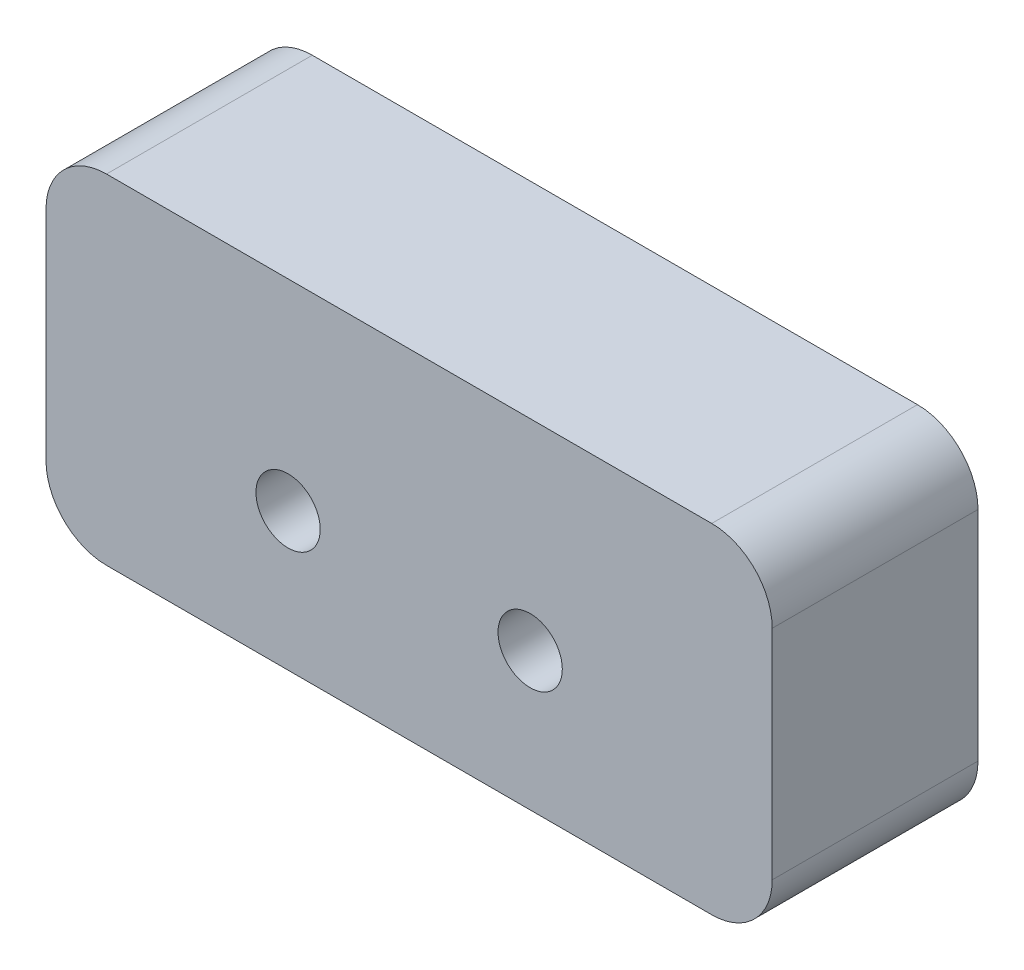
ISO-10303-21;
HEADER;
FILE_DESCRIPTION(('STEP AP214'),'2;1');
FILE_NAME('part.step','',(''),(''),'','','');
FILE_SCHEMA(('AUTOMOTIVE_DESIGN { 1 0 10303 214 1 1 1 1 }'));
ENDSEC;
DATA;
#1=APPLICATION_CONTEXT('core data for automotive mechanical design processes');
#2=APPLICATION_PROTOCOL_DEFINITION('international standard','automotive_design',2000,#1);
#3=PRODUCT_CONTEXT('',#1,'mechanical');
#4=PRODUCT('Part','Part','',(#3));
#5=PRODUCT_RELATED_PRODUCT_CATEGORY('part','',(#4));
#6=PRODUCT_DEFINITION_FORMATION('','',#4);
#7=PRODUCT_DEFINITION_CONTEXT('part definition',#1,'design');
#8=PRODUCT_DEFINITION('design','',#6,#7);
#9=PRODUCT_DEFINITION_SHAPE('','',#8);
#10=(LENGTH_UNIT() NAMED_UNIT(*) SI_UNIT(.MILLI.,.METRE.));
#11=(NAMED_UNIT(*) PLANE_ANGLE_UNIT() SI_UNIT($,.RADIAN.));
#12=(NAMED_UNIT(*) SI_UNIT($,.STERADIAN.) SOLID_ANGLE_UNIT());
#13=UNCERTAINTY_MEASURE_WITH_UNIT(LENGTH_MEASURE(1.E-05),#10,'distance_accuracy_value','');
#14=(GEOMETRIC_REPRESENTATION_CONTEXT(3) GLOBAL_UNCERTAINTY_ASSIGNED_CONTEXT((#13)) GLOBAL_UNIT_ASSIGNED_CONTEXT((#10,
#11,#12)) REPRESENTATION_CONTEXT('',''));
#15=CARTESIAN_POINT('',(0.,0.,0.));
#16=DIRECTION('',(0.,0.,1.));
#17=DIRECTION('',(1.,0.,0.));
#18=AXIS2_PLACEMENT_3D('',#15,#16,#17);
#19=CARTESIAN_POINT('',(0.,0.,21.59));
#20=DIRECTION('',(0.,0.,-1.));
#21=DIRECTION('',(-1.,0.,0.));
#22=AXIS2_PLACEMENT_3D('',#19,#20,#21);
#23=PLANE('',#22);
#24=DIRECTION('',(1.,0.,0.));
#25=VECTOR('',#24,1.);
#26=CARTESIAN_POINT('',(76.2,0.,21.59));
#27=LINE('',#26,#25);
#28=CARTESIAN_POINT('',(6.35000000000002,0.,21.59));
#29=VERTEX_POINT('',#28);
#30=CARTESIAN_POINT('',(69.85,0.,21.59));
#31=VERTEX_POINT('',#30);
#32=EDGE_CURVE('E136',#29,#31,#27,.T.);
#33=ORIENTED_EDGE('',*,*,#32,.T.);
#34=CARTESIAN_POINT('',(69.85,6.35,21.59));
#35=DIRECTION('',(0.,0.,-1.));
#36=DIRECTION('',(-1.,0.,0.));
#37=AXIS2_PLACEMENT_3D('',#34,#35,#36);
#38=CIRCLE('',#37,6.35);
#39=CARTESIAN_POINT('',(76.2,6.35,21.59));
#40=VERTEX_POINT('',#39);
#41=EDGE_CURVE('E181',#31,#40,#38,.F.);
#42=ORIENTED_EDGE('',*,*,#41,.T.);
#43=DIRECTION('',(0.,1.,0.));
#44=VECTOR('',#43,1.);
#45=CARTESIAN_POINT('',(76.2,35.56,21.59));
#46=LINE('',#45,#44);
#47=CARTESIAN_POINT('',(76.2,29.21,21.59));
#48=VERTEX_POINT('',#47);
#49=EDGE_CURVE('E139',#40,#48,#46,.T.);
#50=ORIENTED_EDGE('',*,*,#49,.T.);
#51=CARTESIAN_POINT('',(69.85,29.21,21.59));
#52=DIRECTION('',(0.,0.,-1.));
#53=DIRECTION('',(-1.,0.,0.));
#54=AXIS2_PLACEMENT_3D('',#51,#52,#53);
#55=CIRCLE('',#54,6.35);
#56=CARTESIAN_POINT('',(69.85,35.56,21.59));
#57=VERTEX_POINT('',#56);
#58=EDGE_CURVE('E177',#48,#57,#55,.F.);
#59=ORIENTED_EDGE('',*,*,#58,.T.);
#60=DIRECTION('',(-1.,0.,0.));
#61=VECTOR('',#60,1.);
#62=CARTESIAN_POINT('',(0.,35.56,21.59));
#63=LINE('',#62,#61);
#64=CARTESIAN_POINT('',(6.35,35.56,21.59));
#65=VERTEX_POINT('',#64);
#66=EDGE_CURVE('E143',#57,#65,#63,.T.);
#67=ORIENTED_EDGE('',*,*,#66,.T.);
#68=CARTESIAN_POINT('',(6.35,29.21,21.59));
#69=DIRECTION('',(0.,0.,-1.));
#70=DIRECTION('',(-1.,0.,0.));
#71=AXIS2_PLACEMENT_3D('',#68,#69,#70);
#72=CIRCLE('',#71,6.35);
#73=CARTESIAN_POINT('',(0.,29.21,21.59));
#74=VERTEX_POINT('',#73);
#75=EDGE_CURVE('E62',#65,#74,#72,.F.);
#76=ORIENTED_EDGE('',*,*,#75,.T.);
#77=DIRECTION('',(0.,-1.,0.));
#78=VECTOR('',#77,1.);
#79=CARTESIAN_POINT('',(0.,0.,21.59));
#80=LINE('',#79,#78);
#81=CARTESIAN_POINT('',(0.,6.35,21.59));
#82=VERTEX_POINT('',#81);
#83=EDGE_CURVE('E145',#74,#82,#80,.T.);
#84=ORIENTED_EDGE('',*,*,#83,.T.);
#85=CARTESIAN_POINT('',(6.34999999999999,6.35,21.59));
#86=DIRECTION('',(0.,0.,-1.));
#87=DIRECTION('',(-1.,0.,0.));
#88=AXIS2_PLACEMENT_3D('',#85,#86,#87);
#89=CIRCLE('',#88,6.35);
#90=EDGE_CURVE('E179',#82,#29,#89,.F.);
#91=ORIENTED_EDGE('',*,*,#90,.T.);
#92=EDGE_LOOP('',(#33,#42,#50,#59,#67,#76,#84,#91));
#93=FACE_BOUND('',#92,.T.);
#94=CARTESIAN_POINT('',(25.4,14.478,21.59));
#95=DIRECTION('',(0.,0.,1.));
#96=DIRECTION('',(1.,0.,0.));
#97=AXIS2_PLACEMENT_3D('',#94,#95,#96);
#98=CIRCLE('',#97,3.3734375);
#99=CARTESIAN_POINT('',(28.7734375,14.478,21.59));
#100=VERTEX_POINT('',#99);
#101=EDGE_CURVE('E129',#100,#100,#98,.T.);
#102=ORIENTED_EDGE('',*,*,#101,.F.);
#103=EDGE_LOOP('',(#102));
#104=FACE_BOUND('',#103,.T.);
#105=CARTESIAN_POINT('',(50.8,14.478,21.59));
#106=DIRECTION('',(0.,0.,1.));
#107=DIRECTION('',(1.,0.,0.));
#108=AXIS2_PLACEMENT_3D('',#105,#106,#107);
#109=CIRCLE('',#108,3.3734375);
#110=CARTESIAN_POINT('',(54.1734375,14.478,21.59));
#111=VERTEX_POINT('',#110);
#112=EDGE_CURVE('E121',#111,#111,#109,.T.);
#113=ORIENTED_EDGE('',*,*,#112,.F.);
#114=EDGE_LOOP('',(#113));
#115=FACE_BOUND('',#114,.T.);
#116=ADVANCED_FACE('F40',(#93,#104,#115),#23,.F.);
#117=CARTESIAN_POINT('',(0.,0.,0.));
#118=DIRECTION('',(0.,0.,-1.));
#119=DIRECTION('',(-1.,0.,0.));
#120=AXIS2_PLACEMENT_3D('',#117,#118,#119);
#121=PLANE('',#120);
#122=CARTESIAN_POINT('',(25.4,14.478,0.));
#123=DIRECTION('',(0.,0.,1.));
#124=DIRECTION('',(1.,0.,0.));
#125=AXIS2_PLACEMENT_3D('',#122,#123,#124);
#126=CIRCLE('',#125,3.3734375);
#127=CARTESIAN_POINT('',(28.7734375,14.478,0.));
#128=VERTEX_POINT('',#127);
#129=EDGE_CURVE('E127',#128,#128,#126,.T.);
#130=ORIENTED_EDGE('',*,*,#129,.T.);
#131=EDGE_LOOP('',(#130));
#132=FACE_BOUND('',#131,.T.);
#133=DIRECTION('',(0.,1.,0.));
#134=VECTOR('',#133,1.);
#135=CARTESIAN_POINT('',(76.2,35.56,0.));
#136=LINE('',#135,#134);
#137=CARTESIAN_POINT('',(76.2,6.35,0.));
#138=VERTEX_POINT('',#137);
#139=CARTESIAN_POINT('',(76.2,29.21,0.));
#140=VERTEX_POINT('',#139);
#141=EDGE_CURVE('E151',#138,#140,#136,.T.);
#142=ORIENTED_EDGE('',*,*,#141,.F.);
#143=CARTESIAN_POINT('',(69.85,6.35,0.));
#144=DIRECTION('',(0.,0.,-1.));
#145=DIRECTION('',(-1.,0.,0.));
#146=AXIS2_PLACEMENT_3D('',#143,#144,#145);
#147=CIRCLE('',#146,6.35);
#148=CARTESIAN_POINT('',(69.85,0.,0.));
#149=VERTEX_POINT('',#148);
#150=EDGE_CURVE('E169',#138,#149,#147,.T.);
#151=ORIENTED_EDGE('',*,*,#150,.T.);
#152=DIRECTION('',(1.,0.,0.));
#153=VECTOR('',#152,1.);
#154=CARTESIAN_POINT('',(76.2,0.,0.));
#155=LINE('',#154,#153);
#156=CARTESIAN_POINT('',(6.35000000000002,0.,0.));
#157=VERTEX_POINT('',#156);
#158=EDGE_CURVE('E132',#157,#149,#155,.T.);
#159=ORIENTED_EDGE('',*,*,#158,.F.);
#160=CARTESIAN_POINT('',(6.34999999999999,6.35,0.));
#161=DIRECTION('',(0.,0.,-1.));
#162=DIRECTION('',(-1.,0.,0.));
#163=AXIS2_PLACEMENT_3D('',#160,#161,#162);
#164=CIRCLE('',#163,6.35);
#165=CARTESIAN_POINT('',(0.,6.35,0.));
#166=VERTEX_POINT('',#165);
#167=EDGE_CURVE('E167',#157,#166,#164,.T.);
#168=ORIENTED_EDGE('',*,*,#167,.T.);
#169=DIRECTION('',(0.,-1.,0.));
#170=VECTOR('',#169,1.);
#171=CARTESIAN_POINT('',(0.,0.,0.));
#172=LINE('',#171,#170);
#173=CARTESIAN_POINT('',(0.,29.21,0.));
#174=VERTEX_POINT('',#173);
#175=EDGE_CURVE('E140',#174,#166,#172,.T.);
#176=ORIENTED_EDGE('',*,*,#175,.F.);
#177=CARTESIAN_POINT('',(6.35,29.21,0.));
#178=DIRECTION('',(0.,0.,-1.));
#179=DIRECTION('',(-1.,0.,0.));
#180=AXIS2_PLACEMENT_3D('',#177,#178,#179);
#181=CIRCLE('',#180,6.35);
#182=CARTESIAN_POINT('',(6.35,35.56,0.));
#183=VERTEX_POINT('',#182);
#184=EDGE_CURVE('E163',#174,#183,#181,.T.);
#185=ORIENTED_EDGE('',*,*,#184,.T.);
#186=DIRECTION('',(-1.,0.,0.));
#187=VECTOR('',#186,1.);
#188=CARTESIAN_POINT('',(0.,35.56,0.));
#189=LINE('',#188,#187);
#190=CARTESIAN_POINT('',(69.85,35.56,0.));
#191=VERTEX_POINT('',#190);
#192=EDGE_CURVE('E154',#191,#183,#189,.T.);
#193=ORIENTED_EDGE('',*,*,#192,.F.);
#194=CARTESIAN_POINT('',(69.85,29.21,0.));
#195=DIRECTION('',(0.,0.,-1.));
#196=DIRECTION('',(-1.,0.,0.));
#197=AXIS2_PLACEMENT_3D('',#194,#195,#196);
#198=CIRCLE('',#197,6.35);
#199=EDGE_CURVE('E165',#191,#140,#198,.T.);
#200=ORIENTED_EDGE('',*,*,#199,.T.);
#201=EDGE_LOOP('',(#142,#151,#159,#168,#176,#185,#193,#200));
#202=FACE_BOUND('',#201,.T.);
#203=CARTESIAN_POINT('',(50.8,14.478,0.));
#204=DIRECTION('',(0.,0.,1.));
#205=DIRECTION('',(1.,0.,0.));
#206=AXIS2_PLACEMENT_3D('',#203,#204,#205);
#207=CIRCLE('',#206,3.3734375);
#208=CARTESIAN_POINT('',(54.1734375,14.478,0.));
#209=VERTEX_POINT('',#208);
#210=EDGE_CURVE('E117',#209,#209,#207,.T.);
#211=ORIENTED_EDGE('',*,*,#210,.T.);
#212=EDGE_LOOP('',(#211));
#213=FACE_BOUND('',#212,.T.);
#214=ADVANCED_FACE('F200',(#132,#202,#213),#121,.T.);
#215=CARTESIAN_POINT('',(76.2,0.,21.59));
#216=DIRECTION('',(0.,1.,0.));
#217=DIRECTION('',(0.,0.,1.));
#218=AXIS2_PLACEMENT_3D('',#215,#216,#217);
#219=PLANE('',#218);
#220=ORIENTED_EDGE('',*,*,#158,.T.);
#221=DIRECTION('',(0.,0.,-1.));
#222=VECTOR('',#221,1.);
#223=CARTESIAN_POINT('',(69.85,0.,21.59));
#224=LINE('',#223,#222);
#225=EDGE_CURVE('E174',#149,#31,#224,.F.);
#226=ORIENTED_EDGE('',*,*,#225,.T.);
#227=ORIENTED_EDGE('',*,*,#32,.F.);
#228=DIRECTION('',(0.,0.,-1.));
#229=VECTOR('',#228,1.);
#230=CARTESIAN_POINT('',(6.34999999999999,0.,21.59));
#231=LINE('',#230,#229);
#232=EDGE_CURVE('E171',#29,#157,#231,.T.);
#233=ORIENTED_EDGE('',*,*,#232,.T.);
#234=EDGE_LOOP('',(#220,#226,#227,#233));
#235=FACE_BOUND('',#234,.T.);
#236=ADVANCED_FACE('F209',(#235),#219,.F.);
#237=CARTESIAN_POINT('',(76.2,35.56,21.59));
#238=DIRECTION('',(-1.,0.,0.));
#239=DIRECTION('',(0.,0.,1.));
#240=AXIS2_PLACEMENT_3D('',#237,#238,#239);
#241=PLANE('',#240);
#242=ORIENTED_EDGE('',*,*,#49,.F.);
#243=DIRECTION('',(0.,0.,-1.));
#244=VECTOR('',#243,1.);
#245=CARTESIAN_POINT('',(76.2,6.35,21.59));
#246=LINE('',#245,#244);
#247=EDGE_CURVE('E160',#40,#138,#246,.T.);
#248=ORIENTED_EDGE('',*,*,#247,.T.);
#249=ORIENTED_EDGE('',*,*,#141,.T.);
#250=DIRECTION('',(0.,0.,-1.));
#251=VECTOR('',#250,1.);
#252=CARTESIAN_POINT('',(76.2,29.21,21.59));
#253=LINE('',#252,#251);
#254=EDGE_CURVE('E147',#140,#48,#253,.F.);
#255=ORIENTED_EDGE('',*,*,#254,.T.);
#256=EDGE_LOOP('',(#242,#248,#249,#255));
#257=FACE_BOUND('',#256,.T.);
#258=ADVANCED_FACE('F217',(#257),#241,.F.);
#259=CARTESIAN_POINT('',(0.,35.56,21.59));
#260=DIRECTION('',(0.,-1.,0.));
#261=DIRECTION('',(0.,0.,-1.));
#262=AXIS2_PLACEMENT_3D('',#259,#260,#261);
#263=PLANE('',#262);
#264=ORIENTED_EDGE('',*,*,#66,.F.);
#265=DIRECTION('',(0.,0.,-1.));
#266=VECTOR('',#265,1.);
#267=CARTESIAN_POINT('',(69.85,35.56,21.59));
#268=LINE('',#267,#266);
#269=EDGE_CURVE('E11',#57,#191,#268,.T.);
#270=ORIENTED_EDGE('',*,*,#269,.T.);
#271=ORIENTED_EDGE('',*,*,#192,.T.);
#272=DIRECTION('',(0.,0.,-1.));
#273=VECTOR('',#272,1.);
#274=CARTESIAN_POINT('',(6.35,35.56,21.59));
#275=LINE('',#274,#273);
#276=EDGE_CURVE('E48',#183,#65,#275,.F.);
#277=ORIENTED_EDGE('',*,*,#276,.T.);
#278=EDGE_LOOP('',(#264,#270,#271,#277));
#279=FACE_BOUND('',#278,.T.);
#280=ADVANCED_FACE('F189',(#279),#263,.F.);
#281=CARTESIAN_POINT('',(0.,0.,21.59));
#282=DIRECTION('',(1.,0.,0.));
#283=DIRECTION('',(0.,0.,-1.));
#284=AXIS2_PLACEMENT_3D('',#281,#282,#283);
#285=PLANE('',#284);
#286=CARTESIAN_POINT('',(0.,25.4,10.795));
#287=DIRECTION('',(-1.,0.,0.));
#288=DIRECTION('',(0.,0.,1.));
#289=AXIS2_PLACEMENT_3D('',#286,#287,#288);
#290=CIRCLE('',#289,2.5527);
#291=CARTESIAN_POINT('',(0.,25.4,13.3477));
#292=VERTEX_POINT('',#291);
#293=EDGE_CURVE('E118',#292,#292,#290,.T.);
#294=ORIENTED_EDGE('',*,*,#293,.F.);
#295=EDGE_LOOP('',(#294));
#296=FACE_BOUND('',#295,.T.);
#297=ORIENTED_EDGE('',*,*,#175,.T.);
#298=DIRECTION('',(0.,0.,-1.));
#299=VECTOR('',#298,1.);
#300=CARTESIAN_POINT('',(0.,6.35,21.59));
#301=LINE('',#300,#299);
#302=EDGE_CURVE('E55',#166,#82,#301,.F.);
#303=ORIENTED_EDGE('',*,*,#302,.T.);
#304=ORIENTED_EDGE('',*,*,#83,.F.);
#305=DIRECTION('',(0.,0.,-1.));
#306=VECTOR('',#305,1.);
#307=CARTESIAN_POINT('',(0.,29.21,21.59));
#308=LINE('',#307,#306);
#309=EDGE_CURVE('E183',#74,#174,#308,.T.);
#310=ORIENTED_EDGE('',*,*,#309,.T.);
#311=EDGE_LOOP('',(#297,#303,#304,#310));
#312=FACE_BOUND('',#311,.T.);
#313=ADVANCED_FACE('F197',(#296,#312),#285,.F.);
#314=CARTESIAN_POINT('',(25.4,14.478,21.59));
#315=DIRECTION('',(0.,0.,-1.));
#316=DIRECTION('',(-1.,0.,0.));
#317=AXIS2_PLACEMENT_3D('',#314,#315,#316);
#318=CYLINDRICAL_SURFACE('',#317,3.3734375);
#319=ORIENTED_EDGE('',*,*,#101,.T.);
#320=EDGE_LOOP('',(#319));
#321=FACE_BOUND('',#320,.T.);
#322=ORIENTED_EDGE('',*,*,#129,.F.);
#323=EDGE_LOOP('',(#322));
#324=FACE_BOUND('',#323,.T.);
#325=ADVANCED_FACE('F235',(#321,#324),#318,.F.);
#326=CARTESIAN_POINT('',(50.8,14.478,21.59));
#327=DIRECTION('',(0.,0.,-1.));
#328=DIRECTION('',(-1.,0.,0.));
#329=AXIS2_PLACEMENT_3D('',#326,#327,#328);
#330=CYLINDRICAL_SURFACE('',#329,3.3734375);
#331=ORIENTED_EDGE('',*,*,#112,.T.);
#332=EDGE_LOOP('',(#331));
#333=FACE_BOUND('',#332,.T.);
#334=ORIENTED_EDGE('',*,*,#210,.F.);
#335=EDGE_LOOP('',(#334));
#336=FACE_BOUND('',#335,.T.);
#337=ADVANCED_FACE('F248',(#333,#336),#330,.F.);
#338=CARTESIAN_POINT('',(69.85,6.35,21.59));
#339=DIRECTION('',(0.,0.,-1.));
#340=DIRECTION('',(-1.,0.,0.));
#341=AXIS2_PLACEMENT_3D('',#338,#339,#340);
#342=CYLINDRICAL_SURFACE('',#341,6.35);
#343=ORIENTED_EDGE('',*,*,#41,.F.);
#344=ORIENTED_EDGE('',*,*,#225,.F.);
#345=ORIENTED_EDGE('',*,*,#150,.F.);
#346=ORIENTED_EDGE('',*,*,#247,.F.);
#347=EDGE_LOOP('',(#343,#344,#345,#346));
#348=FACE_BOUND('',#347,.T.);
#349=ADVANCED_FACE('F215',(#348),#342,.T.);
#350=CARTESIAN_POINT('',(6.34999999999999,6.35,21.59));
#351=DIRECTION('',(0.,0.,-1.));
#352=DIRECTION('',(-1.,0.,0.));
#353=AXIS2_PLACEMENT_3D('',#350,#351,#352);
#354=CYLINDRICAL_SURFACE('',#353,6.35);
#355=ORIENTED_EDGE('',*,*,#90,.F.);
#356=ORIENTED_EDGE('',*,*,#302,.F.);
#357=ORIENTED_EDGE('',*,*,#167,.F.);
#358=ORIENTED_EDGE('',*,*,#232,.F.);
#359=EDGE_LOOP('',(#355,#356,#357,#358));
#360=FACE_BOUND('',#359,.T.);
#361=ADVANCED_FACE('F206',(#360),#354,.T.);
#362=CARTESIAN_POINT('',(69.85,29.21,21.59));
#363=DIRECTION('',(0.,0.,-1.));
#364=DIRECTION('',(-1.,0.,0.));
#365=AXIS2_PLACEMENT_3D('',#362,#363,#364);
#366=CYLINDRICAL_SURFACE('',#365,6.35);
#367=ORIENTED_EDGE('',*,*,#58,.F.);
#368=ORIENTED_EDGE('',*,*,#254,.F.);
#369=ORIENTED_EDGE('',*,*,#199,.F.);
#370=ORIENTED_EDGE('',*,*,#269,.F.);
#371=EDGE_LOOP('',(#367,#368,#369,#370));
#372=FACE_BOUND('',#371,.T.);
#373=ADVANCED_FACE('F220',(#372),#366,.T.);
#374=CARTESIAN_POINT('',(6.35,29.21,21.59));
#375=DIRECTION('',(0.,0.,-1.));
#376=DIRECTION('',(-1.,0.,0.));
#377=AXIS2_PLACEMENT_3D('',#374,#375,#376);
#378=CYLINDRICAL_SURFACE('',#377,6.35);
#379=ORIENTED_EDGE('',*,*,#75,.F.);
#380=ORIENTED_EDGE('',*,*,#276,.F.);
#381=ORIENTED_EDGE('',*,*,#184,.F.);
#382=ORIENTED_EDGE('',*,*,#309,.F.);
#383=EDGE_LOOP('',(#379,#380,#381,#382));
#384=FACE_BOUND('',#383,.T.);
#385=ADVANCED_FACE('F42',(#384),#378,.T.);
#386=CARTESIAN_POINT('',(26.67,25.4,10.795));
#387=DIRECTION('',(-1.,0.,0.));
#388=DIRECTION('',(0.,0.,1.));
#389=AXIS2_PLACEMENT_3D('',#386,#387,#388);
#390=CONICAL_SURFACE('',#389,2.55269999999999,1.02974425867665);
#391=CARTESIAN_POINT('',(28.2038169021917,25.4,10.795));
#392=VERTEX_POINT('',#391);
#393=VERTEX_LOOP('',#392);
#394=FACE_BOUND('',#393,.T.);
#395=CARTESIAN_POINT('',(26.67,25.4,10.795));
#396=DIRECTION('',(-1.,0.,0.));
#397=DIRECTION('',(0.,0.,1.));
#398=AXIS2_PLACEMENT_3D('',#395,#396,#397);
#399=CIRCLE('',#398,2.55269999999999);
#400=CARTESIAN_POINT('',(26.67,25.4,13.3477));
#401=VERTEX_POINT('',#400);
#402=EDGE_CURVE('E115',#401,#401,#399,.T.);
#403=ORIENTED_EDGE('',*,*,#402,.T.);
#404=EDGE_LOOP('',(#403));
#405=FACE_BOUND('',#404,.T.);
#406=ADVANCED_FACE('F108',(#394,#405),#390,.F.);
#407=CARTESIAN_POINT('',(0.,25.4,10.795));
#408=DIRECTION('',(-1.,0.,0.));
#409=DIRECTION('',(0.,0.,1.));
#410=AXIS2_PLACEMENT_3D('',#407,#408,#409);
#411=CYLINDRICAL_SURFACE('',#410,2.5527);
#412=ORIENTED_EDGE('',*,*,#402,.F.);
#413=EDGE_LOOP('',(#412));
#414=FACE_BOUND('',#413,.T.);
#415=ORIENTED_EDGE('',*,*,#293,.T.);
#416=EDGE_LOOP('',(#415));
#417=FACE_BOUND('',#416,.T.);
#418=ADVANCED_FACE('F111',(#414,#417),#411,.F.);
#419=CLOSED_SHELL('',(#116,#214,#236,#258,#280,#313,#325,#337,#349,#361,#373,#385,#406,#418));
#420=MANIFOLD_SOLID_BREP('B2',#419);
#421=ADVANCED_BREP_SHAPE_REPRESENTATION('',(#18,#420),#14);
#422=SHAPE_DEFINITION_REPRESENTATION(#9,#421);
ENDSEC;
END-ISO-10303-21;
